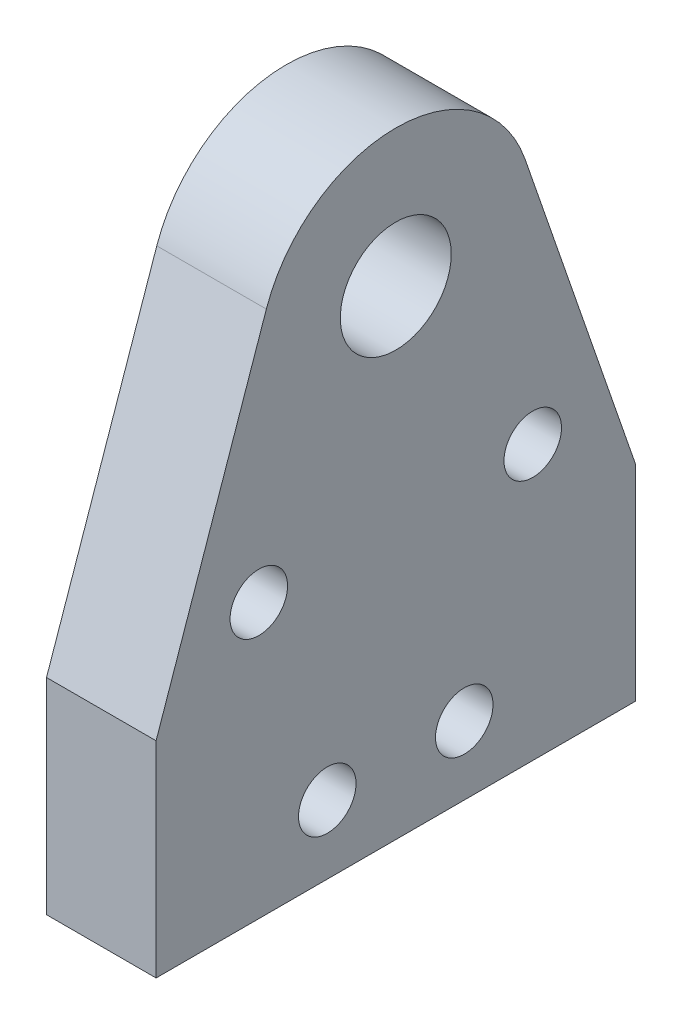
ISO-10303-21;
HEADER;
FILE_DESCRIPTION(('STEP AP214'),'2;1');
FILE_NAME('part.step','',(''),(''),'','','');
FILE_SCHEMA(('AUTOMOTIVE_DESIGN { 1 0 10303 214 1 1 1 1 }'));
ENDSEC;
DATA;
#1=APPLICATION_CONTEXT('core data for automotive mechanical design processes');
#2=APPLICATION_PROTOCOL_DEFINITION('international standard','automotive_design',2000,#1);
#3=PRODUCT_CONTEXT('',#1,'mechanical');
#4=PRODUCT('Part','Part','',(#3));
#5=PRODUCT_RELATED_PRODUCT_CATEGORY('part','',(#4));
#6=PRODUCT_DEFINITION_FORMATION('','',#4);
#7=PRODUCT_DEFINITION_CONTEXT('part definition',#1,'design');
#8=PRODUCT_DEFINITION('design','',#6,#7);
#9=PRODUCT_DEFINITION_SHAPE('','',#8);
#10=(LENGTH_UNIT() NAMED_UNIT(*) SI_UNIT(.MILLI.,.METRE.));
#11=(NAMED_UNIT(*) PLANE_ANGLE_UNIT() SI_UNIT($,.RADIAN.));
#12=(NAMED_UNIT(*) SI_UNIT($,.STERADIAN.) SOLID_ANGLE_UNIT());
#13=UNCERTAINTY_MEASURE_WITH_UNIT(LENGTH_MEASURE(1.E-05),#10,'distance_accuracy_value','');
#14=(GEOMETRIC_REPRESENTATION_CONTEXT(3) GLOBAL_UNCERTAINTY_ASSIGNED_CONTEXT((#13)) GLOBAL_UNIT_ASSIGNED_CONTEXT((#10,
#11,#12)) REPRESENTATION_CONTEXT('',''));
#15=CARTESIAN_POINT('',(0.,0.,0.));
#16=DIRECTION('',(0.,0.,1.));
#17=DIRECTION('',(1.,0.,0.));
#18=AXIS2_PLACEMENT_3D('',#15,#16,#17);
#19=CARTESIAN_POINT('',(-2.,35.,0.));
#20=DIRECTION('',(-1.,0.,0.));
#21=DIRECTION('',(0.,0.,1.));
#22=AXIS2_PLACEMENT_3D('',#19,#20,#21);
#23=PLANE('',#22);
#24=CARTESIAN_POINT('',(-2.,35.,0.));
#25=DIRECTION('',(-1.,0.,0.));
#26=DIRECTION('',(0.,0.,1.));
#27=AXIS2_PLACEMENT_3D('',#24,#25,#26);
#28=CIRCLE('',#27,4.05);
#29=CARTESIAN_POINT('',(-2.,35.,4.05));
#30=VERTEX_POINT('',#29);
#31=EDGE_CURVE('E12',#30,#30,#28,.T.);
#32=ORIENTED_EDGE('',*,*,#31,.F.);
#33=EDGE_LOOP('',(#32));
#34=FACE_BOUND('',#33,.T.);
#35=ADVANCED_FACE('F41',(#34),#23,.F.);
#36=CARTESIAN_POINT('',(-42.,35.,0.));
#37=DIRECTION('',(1.,0.,0.));
#38=DIRECTION('',(0.,0.,-1.));
#39=AXIS2_PLACEMENT_3D('',#36,#37,#38);
#40=CYLINDRICAL_SURFACE('',#39,4.05);
#41=CARTESIAN_POINT('',(4.,35.,0.));
#42=DIRECTION('',(1.,0.,0.));
#43=DIRECTION('',(0.,0.,-1.));
#44=AXIS2_PLACEMENT_3D('',#41,#42,#43);
#45=CIRCLE('',#44,4.05);
#46=CARTESIAN_POINT('',(4.,35.,-4.04999999999999));
#47=VERTEX_POINT('',#46);
#48=EDGE_CURVE('E241',#47,#47,#45,.T.);
#49=ORIENTED_EDGE('',*,*,#48,.T.);
#50=EDGE_LOOP('',(#49));
#51=FACE_BOUND('',#50,.T.);
#52=ORIENTED_EDGE('',*,*,#31,.T.);
#53=EDGE_LOOP('',(#52));
#54=FACE_BOUND('',#53,.T.);
#55=ADVANCED_FACE('F185',(#51,#54),#40,.F.);
#56=CARTESIAN_POINT('',(4.,60.,17.5));
#57=DIRECTION('',(-1.,0.,0.));
#58=DIRECTION('',(0.,0.,1.));
#59=AXIS2_PLACEMENT_3D('',#56,#57,#58);
#60=PLANE('',#59);
#61=CARTESIAN_POINT('',(4.,20.,-10.));
#62=DIRECTION('',(-1.,0.,0.));
#63=DIRECTION('',(0.,0.,1.));
#64=AXIS2_PLACEMENT_3D('',#61,#62,#63);
#65=CIRCLE('',#64,2.1);
#66=CARTESIAN_POINT('',(4.,20.,-7.9));
#67=VERTEX_POINT('',#66);
#68=EDGE_CURVE('E246',#67,#67,#65,.T.);
#69=ORIENTED_EDGE('',*,*,#68,.T.);
#70=EDGE_LOOP('',(#69));
#71=FACE_BOUND('',#70,.T.);
#72=CARTESIAN_POINT('',(4.,5.00000000000001,5.));
#73=DIRECTION('',(-1.,0.,0.));
#74=DIRECTION('',(0.,0.,1.));
#75=AXIS2_PLACEMENT_3D('',#72,#73,#74);
#76=CIRCLE('',#75,2.1);
#77=CARTESIAN_POINT('',(4.,5.00000000000001,7.1));
#78=VERTEX_POINT('',#77);
#79=EDGE_CURVE('E257',#78,#78,#76,.T.);
#80=ORIENTED_EDGE('',*,*,#79,.T.);
#81=EDGE_LOOP('',(#80));
#82=FACE_BOUND('',#81,.T.);
#83=CARTESIAN_POINT('',(4.,5.00000000000001,-5.));
#84=DIRECTION('',(-1.,0.,0.));
#85=DIRECTION('',(0.,0.,1.));
#86=AXIS2_PLACEMENT_3D('',#83,#84,#85);
#87=CIRCLE('',#86,2.1);
#88=CARTESIAN_POINT('',(4.,5.00000000000001,-2.9));
#89=VERTEX_POINT('',#88);
#90=EDGE_CURVE('E261',#89,#89,#87,.T.);
#91=ORIENTED_EDGE('',*,*,#90,.T.);
#92=EDGE_LOOP('',(#91));
#93=FACE_BOUND('',#92,.T.);
#94=CARTESIAN_POINT('',(4.,20.,10.));
#95=DIRECTION('',(-1.,0.,0.));
#96=DIRECTION('',(0.,0.,1.));
#97=AXIS2_PLACEMENT_3D('',#94,#95,#96);
#98=CIRCLE('',#97,2.1);
#99=CARTESIAN_POINT('',(4.,20.,12.1));
#100=VERTEX_POINT('',#99);
#101=EDGE_CURVE('E265',#100,#100,#98,.T.);
#102=ORIENTED_EDGE('',*,*,#101,.T.);
#103=EDGE_LOOP('',(#102));
#104=FACE_BOUND('',#103,.T.);
#105=ORIENTED_EDGE('',*,*,#48,.F.);
#106=EDGE_LOOP('',(#105));
#107=FACE_BOUND('',#106,.T.);
#108=CARTESIAN_POINT('',(4.,35.,0.));
#109=DIRECTION('',(1.,0.,0.));
#110=DIRECTION('',(0.,0.,-1.));
#111=AXIS2_PLACEMENT_3D('',#108,#109,#110);
#112=CIRCLE('',#111,10.);
#113=CARTESIAN_POINT('',(4.,38.2692039480153,-9.45051879773175));
#114=VERTEX_POINT('',#113);
#115=CARTESIAN_POINT('',(4.,38.2692039480153,9.45051879773176));
#116=VERTEX_POINT('',#115);
#117=EDGE_CURVE('E112',#114,#116,#112,.T.);
#118=ORIENTED_EDGE('',*,*,#117,.T.);
#119=DIRECTION('',(0.,0.945051879773176,-0.326920394801528));
#120=VECTOR('',#119,1.);
#121=CARTESIAN_POINT('',(4.,7.00989700681684,20.2640044752498));
#122=LINE('',#121,#120);
#123=CARTESIAN_POINT('',(4.,15.,17.5));
#124=VERTEX_POINT('',#123);
#125=EDGE_CURVE('E109',#124,#116,#122,.T.);
#126=ORIENTED_EDGE('',*,*,#125,.F.);
#127=DIRECTION('',(0.,-1.,0.));
#128=VECTOR('',#127,1.);
#129=CARTESIAN_POINT('',(4.,60.,17.5));
#130=LINE('',#129,#128);
#131=CARTESIAN_POINT('',(4.,0.,17.5));
#132=VERTEX_POINT('',#131);
#133=EDGE_CURVE('E65',#124,#132,#130,.T.);
#134=ORIENTED_EDGE('',*,*,#133,.T.);
#135=DIRECTION('',(0.,0.,-1.));
#136=VECTOR('',#135,1.);
#137=CARTESIAN_POINT('',(4.,0.,17.5));
#138=LINE('',#137,#136);
#139=CARTESIAN_POINT('',(4.,0.,-17.5));
#140=VERTEX_POINT('',#139);
#141=EDGE_CURVE('E138',#132,#140,#138,.T.);
#142=ORIENTED_EDGE('',*,*,#141,.T.);
#143=DIRECTION('',(0.,-1.,0.));
#144=VECTOR('',#143,1.);
#145=CARTESIAN_POINT('',(4.,60.,-17.5));
#146=LINE('',#145,#144);
#147=CARTESIAN_POINT('',(4.,15.,-17.5));
#148=VERTEX_POINT('',#147);
#149=EDGE_CURVE('E121',#148,#140,#146,.T.);
#150=ORIENTED_EDGE('',*,*,#149,.F.);
#151=DIRECTION('',(0.,-0.945051879773176,-0.326920394801529));
#152=VECTOR('',#151,1.);
#153=CARTESIAN_POINT('',(4.,7.00989700681685,-20.2640044752498));
#154=LINE('',#153,#152);
#155=EDGE_CURVE('E101',#114,#148,#154,.T.);
#156=ORIENTED_EDGE('',*,*,#155,.F.);
#157=EDGE_LOOP('',(#118,#126,#134,#142,#150,#156));
#158=FACE_BOUND('',#157,.T.);
#159=ADVANCED_FACE('F120',(#71,#82,#93,#104,#107,#158),#60,.F.);
#160=CARTESIAN_POINT('',(-4.,60.,-17.5));
#161=DIRECTION('',(0.,0.,1.));
#162=DIRECTION('',(1.,0.,0.));
#163=AXIS2_PLACEMENT_3D('',#160,#161,#162);
#164=PLANE('',#163);
#165=DIRECTION('',(0.,-1.,0.));
#166=VECTOR('',#165,1.);
#167=CARTESIAN_POINT('',(-4.,60.,-17.5));
#168=LINE('',#167,#166);
#169=CARTESIAN_POINT('',(-4.,15.,-17.5));
#170=VERTEX_POINT('',#169);
#171=CARTESIAN_POINT('',(-4.,0.,-17.5));
#172=VERTEX_POINT('',#171);
#173=EDGE_CURVE('E157',#170,#172,#168,.T.);
#174=ORIENTED_EDGE('',*,*,#173,.F.);
#175=DIRECTION('',(1.,0.,0.));
#176=VECTOR('',#175,1.);
#177=CARTESIAN_POINT('',(-56.,15.,-17.5));
#178=LINE('',#177,#176);
#179=EDGE_CURVE('E108',#170,#148,#178,.T.);
#180=ORIENTED_EDGE('',*,*,#179,.T.);
#181=ORIENTED_EDGE('',*,*,#149,.T.);
#182=DIRECTION('',(-1.,0.,0.));
#183=VECTOR('',#182,1.);
#184=CARTESIAN_POINT('',(-4.,0.,-17.5));
#185=LINE('',#184,#183);
#186=EDGE_CURVE('E141',#140,#172,#185,.T.);
#187=ORIENTED_EDGE('',*,*,#186,.T.);
#188=EDGE_LOOP('',(#174,#180,#181,#187));
#189=FACE_BOUND('',#188,.T.);
#190=ADVANCED_FACE('F177',(#189),#164,.F.);
#191=CARTESIAN_POINT('',(-4.,60.,17.5));
#192=DIRECTION('',(0.,0.,-1.));
#193=DIRECTION('',(-1.,0.,0.));
#194=AXIS2_PLACEMENT_3D('',#191,#192,#193);
#195=PLANE('',#194);
#196=ORIENTED_EDGE('',*,*,#133,.F.);
#197=DIRECTION('',(1.,0.,0.));
#198=VECTOR('',#197,1.);
#199=CARTESIAN_POINT('',(-56.,15.,17.5));
#200=LINE('',#199,#198);
#201=CARTESIAN_POINT('',(-4.,15.,17.5));
#202=VERTEX_POINT('',#201);
#203=EDGE_CURVE('E132',#202,#124,#200,.T.);
#204=ORIENTED_EDGE('',*,*,#203,.F.);
#205=DIRECTION('',(0.,-1.,0.));
#206=VECTOR('',#205,1.);
#207=CARTESIAN_POINT('',(-4.,60.,17.5));
#208=LINE('',#207,#206);
#209=CARTESIAN_POINT('',(-4.,0.,17.5));
#210=VERTEX_POINT('',#209);
#211=EDGE_CURVE('E154',#202,#210,#208,.T.);
#212=ORIENTED_EDGE('',*,*,#211,.T.);
#213=DIRECTION('',(1.,0.,0.));
#214=VECTOR('',#213,1.);
#215=CARTESIAN_POINT('',(-4.,0.,17.5));
#216=LINE('',#215,#214);
#217=EDGE_CURVE('E149',#210,#132,#216,.T.);
#218=ORIENTED_EDGE('',*,*,#217,.T.);
#219=EDGE_LOOP('',(#196,#204,#212,#218));
#220=FACE_BOUND('',#219,.T.);
#221=ADVANCED_FACE('F170',(#220),#195,.F.);
#222=CARTESIAN_POINT('',(0.,0.,0.));
#223=DIRECTION('',(0.,-1.,0.));
#224=DIRECTION('',(0.,0.,-1.));
#225=AXIS2_PLACEMENT_3D('',#222,#223,#224);
#226=PLANE('',#225);
#227=CARTESIAN_POINT('',(0.,0.,12.5));
#228=DIRECTION('',(0.,-1.,0.));
#229=DIRECTION('',(0.,0.,-1.));
#230=AXIS2_PLACEMENT_3D('',#227,#228,#229);
#231=CIRCLE('',#230,2.1);
#232=CARTESIAN_POINT('',(0.,0.,10.4));
#233=VERTEX_POINT('',#232);
#234=EDGE_CURVE('E234',#233,#233,#231,.T.);
#235=ORIENTED_EDGE('',*,*,#234,.F.);
#236=EDGE_LOOP('',(#235));
#237=FACE_BOUND('',#236,.T.);
#238=CARTESIAN_POINT('',(0.,0.,-12.5));
#239=DIRECTION('',(0.,-1.,0.));
#240=DIRECTION('',(0.,0.,-1.));
#241=AXIS2_PLACEMENT_3D('',#238,#239,#240);
#242=CIRCLE('',#241,2.1);
#243=CARTESIAN_POINT('',(0.,0.,-14.6));
#244=VERTEX_POINT('',#243);
#245=EDGE_CURVE('E237',#244,#244,#242,.T.);
#246=ORIENTED_EDGE('',*,*,#245,.F.);
#247=EDGE_LOOP('',(#246));
#248=FACE_BOUND('',#247,.T.);
#249=ORIENTED_EDGE('',*,*,#141,.F.);
#250=ORIENTED_EDGE('',*,*,#217,.F.);
#251=DIRECTION('',(0.,0.,1.));
#252=VECTOR('',#251,1.);
#253=CARTESIAN_POINT('',(-4.,0.,17.5));
#254=LINE('',#253,#252);
#255=EDGE_CURVE('E145',#172,#210,#254,.T.);
#256=ORIENTED_EDGE('',*,*,#255,.F.);
#257=ORIENTED_EDGE('',*,*,#186,.F.);
#258=EDGE_LOOP('',(#249,#250,#256,#257));
#259=FACE_BOUND('',#258,.T.);
#260=ADVANCED_FACE('F174',(#237,#248,#259),#226,.T.);
#261=CARTESIAN_POINT('',(-56.,35.,0.));
#262=DIRECTION('',(1.,0.,0.));
#263=DIRECTION('',(0.,0.,-1.));
#264=AXIS2_PLACEMENT_3D('',#261,#262,#263);
#265=CYLINDRICAL_SURFACE('',#264,10.);
#266=CARTESIAN_POINT('',(-4.,35.,0.));
#267=DIRECTION('',(1.,0.,0.));
#268=DIRECTION('',(0.,0.,-1.));
#269=AXIS2_PLACEMENT_3D('',#266,#267,#268);
#270=CIRCLE('',#269,10.);
#271=CARTESIAN_POINT('',(-4.,38.2692039480153,-9.45051879773175));
#272=VERTEX_POINT('',#271);
#273=CARTESIAN_POINT('',(-4.,38.2692039480153,9.45051879773176));
#274=VERTEX_POINT('',#273);
#275=EDGE_CURVE('E50',#272,#274,#270,.T.);
#276=ORIENTED_EDGE('',*,*,#275,.T.);
#277=DIRECTION('',(1.,0.,0.));
#278=VECTOR('',#277,1.);
#279=CARTESIAN_POINT('',(-56.,38.2692039480153,9.45051879773176));
#280=LINE('',#279,#278);
#281=EDGE_CURVE('E114',#274,#116,#280,.T.);
#282=ORIENTED_EDGE('',*,*,#281,.T.);
#283=ORIENTED_EDGE('',*,*,#117,.F.);
#284=DIRECTION('',(1.,0.,0.));
#285=VECTOR('',#284,1.);
#286=CARTESIAN_POINT('',(-56.,38.2692039480153,-9.45051879773175));
#287=LINE('',#286,#285);
#288=EDGE_CURVE('E97',#272,#114,#287,.T.);
#289=ORIENTED_EDGE('',*,*,#288,.F.);
#290=EDGE_LOOP('',(#276,#282,#283,#289));
#291=FACE_BOUND('',#290,.T.);
#292=ADVANCED_FACE('F113',(#291),#265,.T.);
#293=CARTESIAN_POINT('',(-56.,7.00989700681685,-20.2640044752498));
#294=DIRECTION('',(0.,-0.326920394801529,0.945051879773176));
#295=DIRECTION('',(0.,-0.945051879773176,-0.326920394801529));
#296=AXIS2_PLACEMENT_3D('',#293,#294,#295);
#297=PLANE('',#296);
#298=ORIENTED_EDGE('',*,*,#288,.T.);
#299=ORIENTED_EDGE('',*,*,#155,.T.);
#300=ORIENTED_EDGE('',*,*,#179,.F.);
#301=DIRECTION('',(0.,-0.945051879773176,-0.326920394801529));
#302=VECTOR('',#301,1.);
#303=CARTESIAN_POINT('',(-4.,66.0040231733446,0.143746072753363));
#304=LINE('',#303,#302);
#305=EDGE_CURVE('E104',#272,#170,#304,.T.);
#306=ORIENTED_EDGE('',*,*,#305,.F.);
#307=EDGE_LOOP('',(#298,#299,#300,#306));
#308=FACE_BOUND('',#307,.T.);
#309=ADVANCED_FACE('F99',(#308),#297,.F.);
#310=CARTESIAN_POINT('',(-56.,7.00989700681684,20.2640044752498));
#311=DIRECTION('',(0.,-0.326920394801528,-0.945051879773176));
#312=DIRECTION('',(0.,0.945051879773176,-0.326920394801528));
#313=AXIS2_PLACEMENT_3D('',#310,#311,#312);
#314=PLANE('',#313);
#315=ORIENTED_EDGE('',*,*,#203,.T.);
#316=ORIENTED_EDGE('',*,*,#125,.T.);
#317=ORIENTED_EDGE('',*,*,#281,.F.);
#318=DIRECTION('',(0.,0.945051879773176,-0.326920394801528));
#319=VECTOR('',#318,1.);
#320=CARTESIAN_POINT('',(-4.,55.1905374958266,3.59694698604822));
#321=LINE('',#320,#319);
#322=EDGE_CURVE('E57',#202,#274,#321,.T.);
#323=ORIENTED_EDGE('',*,*,#322,.F.);
#324=EDGE_LOOP('',(#315,#316,#317,#323));
#325=FACE_BOUND('',#324,.T.);
#326=ADVANCED_FACE('F165',(#325),#314,.F.);
#327=CARTESIAN_POINT('',(0.,10.,-12.5));
#328=DIRECTION('',(0.,-1.,0.));
#329=DIRECTION('',(0.,0.,-1.));
#330=AXIS2_PLACEMENT_3D('',#327,#328,#329);
#331=CYLINDRICAL_SURFACE('',#330,2.1);
#332=CARTESIAN_POINT('',(0.,10.,-12.5));
#333=DIRECTION('',(0.,-1.,0.));
#334=DIRECTION('',(0.,0.,-1.));
#335=AXIS2_PLACEMENT_3D('',#332,#333,#334);
#336=CIRCLE('',#335,2.1);
#337=CARTESIAN_POINT('',(0.,10.,-14.6));
#338=VERTEX_POINT('',#337);
#339=EDGE_CURVE('E240',#338,#338,#336,.T.);
#340=ORIENTED_EDGE('',*,*,#339,.F.);
#341=EDGE_LOOP('',(#340));
#342=FACE_BOUND('',#341,.T.);
#343=ORIENTED_EDGE('',*,*,#245,.T.);
#344=EDGE_LOOP('',(#343));
#345=FACE_BOUND('',#344,.T.);
#346=ADVANCED_FACE('F216',(#342,#345),#331,.F.);
#347=CARTESIAN_POINT('',(0.,10.,0.));
#348=DIRECTION('',(0.,-1.,0.));
#349=DIRECTION('',(0.,0.,-1.));
#350=AXIS2_PLACEMENT_3D('',#347,#348,#349);
#351=PLANE('',#350);
#352=ORIENTED_EDGE('',*,*,#339,.T.);
#353=EDGE_LOOP('',(#352));
#354=FACE_BOUND('',#353,.T.);
#355=ADVANCED_FACE('F212',(#354),#351,.T.);
#356=CARTESIAN_POINT('',(0.,10.,12.5));
#357=DIRECTION('',(0.,-1.,0.));
#358=DIRECTION('',(0.,0.,-1.));
#359=AXIS2_PLACEMENT_3D('',#356,#357,#358);
#360=CYLINDRICAL_SURFACE('',#359,2.1);
#361=CARTESIAN_POINT('',(0.,10.,12.5));
#362=DIRECTION('',(0.,-1.,0.));
#363=DIRECTION('',(0.,0.,-1.));
#364=AXIS2_PLACEMENT_3D('',#361,#362,#363);
#365=CIRCLE('',#364,2.1);
#366=CARTESIAN_POINT('',(0.,10.,10.4));
#367=VERTEX_POINT('',#366);
#368=EDGE_CURVE('E117',#367,#367,#365,.T.);
#369=ORIENTED_EDGE('',*,*,#368,.F.);
#370=EDGE_LOOP('',(#369));
#371=FACE_BOUND('',#370,.T.);
#372=ORIENTED_EDGE('',*,*,#234,.T.);
#373=EDGE_LOOP('',(#372));
#374=FACE_BOUND('',#373,.T.);
#375=ADVANCED_FACE('F208',(#371,#374),#360,.F.);
#376=CARTESIAN_POINT('',(0.,10.,0.));
#377=DIRECTION('',(0.,-1.,0.));
#378=DIRECTION('',(0.,0.,-1.));
#379=AXIS2_PLACEMENT_3D('',#376,#377,#378);
#380=PLANE('',#379);
#381=ORIENTED_EDGE('',*,*,#368,.T.);
#382=EDGE_LOOP('',(#381));
#383=FACE_BOUND('',#382,.T.);
#384=ADVANCED_FACE('F204',(#383),#380,.T.);
#385=CARTESIAN_POINT('',(6.,20.,10.));
#386=DIRECTION('',(-1.,0.,0.));
#387=DIRECTION('',(0.,0.,1.));
#388=AXIS2_PLACEMENT_3D('',#385,#386,#387);
#389=CYLINDRICAL_SURFACE('',#388,2.1);
#390=CARTESIAN_POINT('',(-4.,20.,10.));
#391=DIRECTION('',(-1.,0.,0.));
#392=DIRECTION('',(0.,0.,1.));
#393=AXIS2_PLACEMENT_3D('',#390,#391,#392);
#394=CIRCLE('',#393,2.1);
#395=CARTESIAN_POINT('',(-4.,20.,12.1));
#396=VERTEX_POINT('',#395);
#397=EDGE_CURVE('E274',#396,#396,#394,.T.);
#398=ORIENTED_EDGE('',*,*,#397,.T.);
#399=EDGE_LOOP('',(#398));
#400=FACE_BOUND('',#399,.T.);
#401=ORIENTED_EDGE('',*,*,#101,.F.);
#402=EDGE_LOOP('',(#401));
#403=FACE_BOUND('',#402,.T.);
#404=ADVANCED_FACE('F207',(#400,#403),#389,.F.);
#405=CARTESIAN_POINT('',(6.,5.00000000000001,-5.));
#406=DIRECTION('',(-1.,0.,0.));
#407=DIRECTION('',(0.,0.,1.));
#408=AXIS2_PLACEMENT_3D('',#405,#406,#407);
#409=CYLINDRICAL_SURFACE('',#408,2.1);
#410=CARTESIAN_POINT('',(-4.,5.00000000000001,-5.));
#411=DIRECTION('',(-1.,0.,0.));
#412=DIRECTION('',(0.,0.,1.));
#413=AXIS2_PLACEMENT_3D('',#410,#411,#412);
#414=CIRCLE('',#413,2.1);
#415=CARTESIAN_POINT('',(-4.,5.00000000000001,-2.9));
#416=VERTEX_POINT('',#415);
#417=EDGE_CURVE('E270',#416,#416,#414,.T.);
#418=ORIENTED_EDGE('',*,*,#417,.T.);
#419=EDGE_LOOP('',(#418));
#420=FACE_BOUND('',#419,.T.);
#421=ORIENTED_EDGE('',*,*,#90,.F.);
#422=EDGE_LOOP('',(#421));
#423=FACE_BOUND('',#422,.T.);
#424=ADVANCED_FACE('F202',(#420,#423),#409,.F.);
#425=CARTESIAN_POINT('',(6.,5.00000000000001,5.));
#426=DIRECTION('',(-1.,0.,0.));
#427=DIRECTION('',(0.,0.,1.));
#428=AXIS2_PLACEMENT_3D('',#425,#426,#427);
#429=CYLINDRICAL_SURFACE('',#428,2.1);
#430=CARTESIAN_POINT('',(-4.,5.00000000000001,5.));
#431=DIRECTION('',(-1.,0.,0.));
#432=DIRECTION('',(0.,0.,1.));
#433=AXIS2_PLACEMENT_3D('',#430,#431,#432);
#434=CIRCLE('',#433,2.1);
#435=CARTESIAN_POINT('',(-4.,5.00000000000001,7.1));
#436=VERTEX_POINT('',#435);
#437=EDGE_CURVE('E275',#436,#436,#434,.T.);
#438=ORIENTED_EDGE('',*,*,#437,.T.);
#439=EDGE_LOOP('',(#438));
#440=FACE_BOUND('',#439,.T.);
#441=ORIENTED_EDGE('',*,*,#79,.F.);
#442=EDGE_LOOP('',(#441));
#443=FACE_BOUND('',#442,.T.);
#444=ADVANCED_FACE('F305',(#440,#443),#429,.F.);
#445=CARTESIAN_POINT('',(6.,20.,-10.));
#446=DIRECTION('',(-1.,0.,0.));
#447=DIRECTION('',(0.,0.,1.));
#448=AXIS2_PLACEMENT_3D('',#445,#446,#447);
#449=CYLINDRICAL_SURFACE('',#448,2.1);
#450=CARTESIAN_POINT('',(-4.,20.,-10.));
#451=DIRECTION('',(-1.,0.,0.));
#452=DIRECTION('',(0.,0.,1.));
#453=AXIS2_PLACEMENT_3D('',#450,#451,#452);
#454=CIRCLE('',#453,2.1);
#455=CARTESIAN_POINT('',(-4.,20.,-7.9));
#456=VERTEX_POINT('',#455);
#457=EDGE_CURVE('E269',#456,#456,#454,.T.);
#458=ORIENTED_EDGE('',*,*,#457,.T.);
#459=EDGE_LOOP('',(#458));
#460=FACE_BOUND('',#459,.T.);
#461=ORIENTED_EDGE('',*,*,#68,.F.);
#462=EDGE_LOOP('',(#461));
#463=FACE_BOUND('',#462,.T.);
#464=ADVANCED_FACE('F285',(#460,#463),#449,.F.);
#465=CARTESIAN_POINT('',(-4.,35.,0.));
#466=DIRECTION('',(-1.,0.,0.));
#467=DIRECTION('',(0.,0.,1.));
#468=AXIS2_PLACEMENT_3D('',#465,#466,#467);
#469=PLANE('',#468);
#470=ORIENTED_EDGE('',*,*,#457,.F.);
#471=EDGE_LOOP('',(#470));
#472=FACE_BOUND('',#471,.T.);
#473=ORIENTED_EDGE('',*,*,#437,.F.);
#474=EDGE_LOOP('',(#473));
#475=FACE_BOUND('',#474,.T.);
#476=ORIENTED_EDGE('',*,*,#417,.F.);
#477=EDGE_LOOP('',(#476));
#478=FACE_BOUND('',#477,.T.);
#479=ORIENTED_EDGE('',*,*,#397,.F.);
#480=EDGE_LOOP('',(#479));
#481=FACE_BOUND('',#480,.T.);
#482=ORIENTED_EDGE('',*,*,#211,.F.);
#483=ORIENTED_EDGE('',*,*,#322,.T.);
#484=ORIENTED_EDGE('',*,*,#275,.F.);
#485=ORIENTED_EDGE('',*,*,#305,.T.);
#486=ORIENTED_EDGE('',*,*,#173,.T.);
#487=ORIENTED_EDGE('',*,*,#255,.T.);
#488=EDGE_LOOP('',(#482,#483,#484,#485,#486,#487));
#489=FACE_BOUND('',#488,.T.);
#490=ADVANCED_FACE('F43',(#472,#475,#478,#481,#489),#469,.T.);
#491=CLOSED_SHELL('',(#35,#55,#159,#190,#221,#260,#292,#309,#326,#346,#355,#375,#384,#404,#424,
#444,#464,#490));
#492=MANIFOLD_SOLID_BREP('B2',#491);
#493=ADVANCED_BREP_SHAPE_REPRESENTATION('',(#18,#492),#14);
#494=SHAPE_DEFINITION_REPRESENTATION(#9,#493);
ENDSEC;
END-ISO-10303-21;
